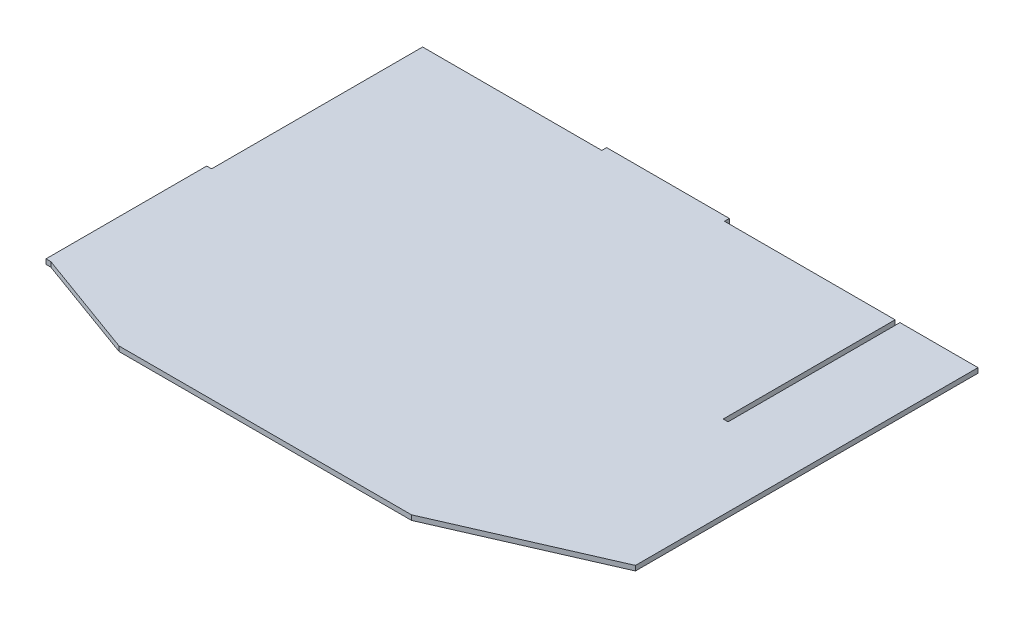
ISO-10303-21;
HEADER;
FILE_DESCRIPTION(('STEP AP214'),'2;1');
FILE_NAME('part.step','',(''),(''),'','','');
FILE_SCHEMA(('AUTOMOTIVE_DESIGN { 1 0 10303 214 1 1 1 1 }'));
ENDSEC;
DATA;
#1=APPLICATION_CONTEXT('core data for automotive mechanical design processes');
#2=APPLICATION_PROTOCOL_DEFINITION('international standard','automotive_design',2000,#1);
#3=PRODUCT_CONTEXT('',#1,'mechanical');
#4=PRODUCT('Part','Part','',(#3));
#5=PRODUCT_RELATED_PRODUCT_CATEGORY('part','',(#4));
#6=PRODUCT_DEFINITION_FORMATION('','',#4);
#7=PRODUCT_DEFINITION_CONTEXT('part definition',#1,'design');
#8=PRODUCT_DEFINITION('design','',#6,#7);
#9=PRODUCT_DEFINITION_SHAPE('','',#8);
#10=(LENGTH_UNIT() NAMED_UNIT(*) SI_UNIT(.MILLI.,.METRE.));
#11=(NAMED_UNIT(*) PLANE_ANGLE_UNIT() SI_UNIT($,.RADIAN.));
#12=(NAMED_UNIT(*) SI_UNIT($,.STERADIAN.) SOLID_ANGLE_UNIT());
#13=UNCERTAINTY_MEASURE_WITH_UNIT(LENGTH_MEASURE(1.E-05),#10,'distance_accuracy_value','');
#14=(GEOMETRIC_REPRESENTATION_CONTEXT(3) GLOBAL_UNCERTAINTY_ASSIGNED_CONTEXT((#13)) GLOBAL_UNIT_ASSIGNED_CONTEXT((#10,
#11,#12)) REPRESENTATION_CONTEXT('',''));
#15=CARTESIAN_POINT('',(0.,0.,0.));
#16=DIRECTION('',(0.,0.,1.));
#17=DIRECTION('',(1.,0.,0.));
#18=AXIS2_PLACEMENT_3D('',#15,#16,#17);
#19=CARTESIAN_POINT('',(-154.05608,-1.5875,267.83));
#20=DIRECTION('',(1.,0.,0.));
#21=DIRECTION('',(0.,0.,-1.));
#22=AXIS2_PLACEMENT_3D('',#19,#20,#21);
#23=PLANE('',#22);
#24=DIRECTION('',(0.,-1.,0.));
#25=VECTOR('',#24,1.);
#26=CARTESIAN_POINT('',(-154.05608,-1.59799669999838,137.650000036));
#27=LINE('',#26,#25);
#28=CARTESIAN_POINT('',(-154.05608,1.5875,137.650000036));
#29=VERTEX_POINT('',#28);
#30=CARTESIAN_POINT('',(-154.05608,-1.5875,137.650000036));
#31=VERTEX_POINT('',#30);
#32=EDGE_CURVE('E60',#29,#31,#27,.T.);
#33=ORIENTED_EDGE('',*,*,#32,.F.);
#34=DIRECTION('',(0.,0.,-1.));
#35=VECTOR('',#34,1.);
#36=CARTESIAN_POINT('',(-154.05608,1.5875,267.83));
#37=LINE('',#36,#35);
#38=CARTESIAN_POINT('',(-154.05608,1.5875,0.));
#39=VERTEX_POINT('',#38);
#40=EDGE_CURVE('E53',#29,#39,#37,.T.);
#41=ORIENTED_EDGE('',*,*,#40,.T.);
#42=DIRECTION('',(0.,-1.,0.));
#43=VECTOR('',#42,1.);
#44=CARTESIAN_POINT('',(-154.05608,-1.5875,0.));
#45=LINE('',#44,#43);
#46=CARTESIAN_POINT('',(-154.05608,-1.5875,0.));
#47=VERTEX_POINT('',#46);
#48=EDGE_CURVE('E291',#39,#47,#45,.T.);
#49=ORIENTED_EDGE('',*,*,#48,.T.);
#50=DIRECTION('',(0.,0.,-1.));
#51=VECTOR('',#50,1.);
#52=CARTESIAN_POINT('',(-154.05608,-1.5875,267.83));
#53=LINE('',#52,#51);
#54=EDGE_CURVE('E299',#31,#47,#53,.T.);
#55=ORIENTED_EDGE('',*,*,#54,.F.);
#56=EDGE_LOOP('',(#33,#41,#49,#55));
#57=FACE_BOUND('',#56,.T.);
#58=ADVANCED_FACE('F45',(#57),#23,.F.);
#59=CARTESIAN_POINT('',(0.,0.,0.));
#60=DIRECTION('',(0.,0.,-1.));
#61=DIRECTION('',(-1.,0.,0.));
#62=AXIS2_PLACEMENT_3D('',#59,#60,#61);
#63=PLANE('',#62);
#64=DIRECTION('',(-1.,0.,0.));
#65=VECTOR('',#64,1.);
#66=CARTESIAN_POINT('',(-154.05608,1.5875,0.));
#67=LINE('',#66,#65);
#68=CARTESIAN_POINT('',(-37.2160000199976,1.58750000000041,0.));
#69=VERTEX_POINT('',#68);
#70=EDGE_CURVE('E287',#69,#39,#67,.T.);
#71=ORIENTED_EDGE('',*,*,#70,.F.);
#72=DIRECTION('',(0.,1.,0.));
#73=VECTOR('',#72,1.);
#74=CARTESIAN_POINT('',(-37.2160000199976,1.58750000000041,0.));
#75=LINE('',#74,#73);
#76=CARTESIAN_POINT('',(-37.2160000199976,-1.5875000000004,0.));
#77=VERTEX_POINT('',#76);
#78=EDGE_CURVE('E207',#77,#69,#75,.T.);
#79=ORIENTED_EDGE('',*,*,#78,.F.);
#80=DIRECTION('',(1.,0.,0.));
#81=VECTOR('',#80,1.);
#82=CARTESIAN_POINT('',(-154.05608,-1.5875,0.));
#83=LINE('',#82,#81);
#84=EDGE_CURVE('E282',#47,#77,#83,.T.);
#85=ORIENTED_EDGE('',*,*,#84,.F.);
#86=ORIENTED_EDGE('',*,*,#48,.F.);
#87=EDGE_LOOP('',(#71,#79,#85,#86));
#88=FACE_BOUND('',#87,.T.);
#89=ADVANCED_FACE('F310',(#88),#63,.T.);
#90=CARTESIAN_POINT('',(42.7839999800023,-1.5875,0.));
#91=VERTEX_POINT('',#90);
#92=CARTESIAN_POINT('',(154.05608,-1.5875,0.));
#93=VERTEX_POINT('',#92);
#94=EDGE_CURVE('E294',#91,#93,#83,.T.);
#95=ORIENTED_EDGE('',*,*,#94,.F.);
#96=DIRECTION('',(0.,-1.,0.));
#97=VECTOR('',#96,1.);
#98=CARTESIAN_POINT('',(42.7839999800024,1.5875000000004,0.));
#99=LINE('',#98,#97);
#100=CARTESIAN_POINT('',(42.7839999800024,1.5875000000004,0.));
#101=VERTEX_POINT('',#100);
#102=EDGE_CURVE('E213',#101,#91,#99,.T.);
#103=ORIENTED_EDGE('',*,*,#102,.F.);
#104=CARTESIAN_POINT('',(154.05608,1.5875,0.));
#105=VERTEX_POINT('',#104);
#106=EDGE_CURVE('E288',#105,#101,#67,.T.);
#107=ORIENTED_EDGE('',*,*,#106,.F.);
#108=DIRECTION('',(0.,1.,0.));
#109=VECTOR('',#108,1.);
#110=CARTESIAN_POINT('',(154.05608,-1.5875,0.));
#111=LINE('',#110,#109);
#112=EDGE_CURVE('E277',#93,#105,#111,.T.);
#113=ORIENTED_EDGE('',*,*,#112,.F.);
#114=EDGE_LOOP('',(#95,#103,#107,#113));
#115=FACE_BOUND('',#114,.T.);
#116=ADVANCED_FACE('F364',(#115),#63,.T.);
#117=CARTESIAN_POINT('',(-154.05608,1.5875,267.83));
#118=DIRECTION('',(0.,-1.,0.));
#119=DIRECTION('',(0.,0.,-1.));
#120=AXIS2_PLACEMENT_3D('',#117,#118,#119);
#121=PLANE('',#120);
#122=ORIENTED_EDGE('',*,*,#40,.F.);
#123=DIRECTION('',(1.,0.,0.));
#124=VECTOR('',#123,1.);
#125=CARTESIAN_POINT('',(-157.23108,1.5875,137.650000036));
#126=LINE('',#125,#124);
#127=CARTESIAN_POINT('',(-157.23108,1.5875,137.650000036));
#128=VERTEX_POINT('',#127);
#129=EDGE_CURVE('E325',#128,#29,#126,.T.);
#130=ORIENTED_EDGE('',*,*,#129,.F.);
#131=DIRECTION('',(0.,0.,-1.));
#132=VECTOR('',#131,1.);
#133=CARTESIAN_POINT('',(-157.23108,1.5875,137.650000036));
#134=LINE('',#133,#132);
#135=CARTESIAN_POINT('',(-157.23108,1.5875,242.43));
#136=VERTEX_POINT('',#135);
#137=EDGE_CURVE('E185',#136,#128,#134,.T.);
#138=ORIENTED_EDGE('',*,*,#137,.F.);
#139=DIRECTION('',(1.,0.,0.));
#140=VECTOR('',#139,1.);
#141=CARTESIAN_POINT('',(-157.23108,1.5875,242.43));
#142=LINE('',#141,#140);
#143=CARTESIAN_POINT('',(-154.05608,1.5875,242.43));
#144=VERTEX_POINT('',#143);
#145=EDGE_CURVE('E198',#136,#144,#142,.T.);
#146=ORIENTED_EDGE('',*,*,#145,.T.);
#147=DIRECTION('',(0.939793423488437,0.,0.341743063086704));
#148=VECTOR('',#147,1.);
#149=CARTESIAN_POINT('',(-95.8526808759125,1.58750000000041,263.594872408759));
#150=LINE('',#149,#148);
#151=CARTESIAN_POINT('',(-84.20608,1.58750000000041,267.83));
#152=VERTEX_POINT('',#151);
#153=EDGE_CURVE('E68',#144,#152,#150,.T.);
#154=ORIENTED_EDGE('',*,*,#153,.T.);
#155=DIRECTION('',(-1.,0.,0.));
#156=VECTOR('',#155,1.);
#157=CARTESIAN_POINT('',(-154.05608,1.5875,267.83));
#158=LINE('',#157,#156);
#159=CARTESIAN_POINT('',(106.50474,1.5875,267.83));
#160=VERTEX_POINT('',#159);
#161=EDGE_CURVE('E278',#160,#152,#158,.T.);
#162=ORIENTED_EDGE('',*,*,#161,.F.);
#163=DIRECTION('',(0.916157334902189,0.,-0.400818834019708));
#164=VECTOR('',#163,1.);
#165=CARTESIAN_POINT('',(115.461286098361,1.5875,263.911511081967));
#166=LINE('',#165,#164);
#167=CARTESIAN_POINT('',(208.10474,1.5875,223.38));
#168=VERTEX_POINT('',#167);
#169=EDGE_CURVE('E231',#160,#168,#166,.T.);
#170=ORIENTED_EDGE('',*,*,#169,.T.);
#171=DIRECTION('',(0.,0.,1.));
#172=VECTOR('',#171,1.);
#173=CARTESIAN_POINT('',(208.10474,1.5875,0.));
#174=LINE('',#173,#172);
#175=CARTESIAN_POINT('',(208.10474,1.5875,0.));
#176=VERTEX_POINT('',#175);
#177=EDGE_CURVE('E258',#176,#168,#174,.T.);
#178=ORIENTED_EDGE('',*,*,#177,.F.);
#179=DIRECTION('',(-1.,0.,0.));
#180=VECTOR('',#179,1.);
#181=CARTESIAN_POINT('',(157.23108,1.5875,0.));
#182=LINE('',#181,#180);
#183=CARTESIAN_POINT('',(157.23108,1.5875,0.));
#184=VERTEX_POINT('',#183);
#185=EDGE_CURVE('E250',#176,#184,#182,.T.);
#186=ORIENTED_EDGE('',*,*,#185,.T.);
#187=DIRECTION('',(0.,0.,1.));
#188=VECTOR('',#187,1.);
#189=CARTESIAN_POINT('',(157.23108,1.5875,0.));
#190=LINE('',#189,#188);
#191=CARTESIAN_POINT('',(157.23108,1.5875,112.128));
#192=VERTEX_POINT('',#191);
#193=EDGE_CURVE('E254',#184,#192,#190,.T.);
#194=ORIENTED_EDGE('',*,*,#193,.T.);
#195=DIRECTION('',(-1.,0.,0.));
#196=VECTOR('',#195,1.);
#197=CARTESIAN_POINT('',(157.23108,1.5875,112.128));
#198=LINE('',#197,#196);
#199=CARTESIAN_POINT('',(154.05608,1.5875,112.128));
#200=VERTEX_POINT('',#199);
#201=EDGE_CURVE('E269',#192,#200,#198,.T.);
#202=ORIENTED_EDGE('',*,*,#201,.T.);
#203=DIRECTION('',(0.,0.,-1.));
#204=VECTOR('',#203,1.);
#205=CARTESIAN_POINT('',(154.05608,1.5875,267.83));
#206=LINE('',#205,#204);
#207=EDGE_CURVE('E11',#200,#105,#206,.T.);
#208=ORIENTED_EDGE('',*,*,#207,.T.);
#209=ORIENTED_EDGE('',*,*,#106,.T.);
#210=DIRECTION('',(0.,0.,1.));
#211=VECTOR('',#210,1.);
#212=CARTESIAN_POINT('',(42.7839999800024,1.5875000000004,-3.175));
#213=LINE('',#212,#211);
#214=CARTESIAN_POINT('',(42.7839999800024,1.5875000000004,-3.175));
#215=VERTEX_POINT('',#214);
#216=EDGE_CURVE('E227',#215,#101,#213,.T.);
#217=ORIENTED_EDGE('',*,*,#216,.F.);
#218=DIRECTION('',(1.,0.,0.));
#219=VECTOR('',#218,1.);
#220=CARTESIAN_POINT('',(-37.2160000199976,1.58750000000041,-3.175));
#221=LINE('',#220,#219);
#222=CARTESIAN_POINT('',(-37.2160000199976,1.58750000000041,-3.175));
#223=VERTEX_POINT('',#222);
#224=EDGE_CURVE('E212',#223,#215,#221,.T.);
#225=ORIENTED_EDGE('',*,*,#224,.F.);
#226=DIRECTION('',(0.,0.,1.));
#227=VECTOR('',#226,1.);
#228=CARTESIAN_POINT('',(-37.2160000199976,1.58750000000041,-3.175));
#229=LINE('',#228,#227);
#230=EDGE_CURVE('E229',#223,#69,#229,.T.);
#231=ORIENTED_EDGE('',*,*,#230,.T.);
#232=ORIENTED_EDGE('',*,*,#70,.T.);
#233=EDGE_LOOP('',(#122,#130,#138,#146,#154,#162,#170,#178,#186,#194,#202,#208,#209,#217,#225,
#231,#232));
#234=FACE_BOUND('',#233,.T.);
#235=ADVANCED_FACE('F306',(#234),#121,.F.);
#236=CARTESIAN_POINT('',(-154.05608,-1.5875,267.83));
#237=DIRECTION('',(0.,1.,0.));
#238=DIRECTION('',(0.,0.,1.));
#239=AXIS2_PLACEMENT_3D('',#236,#237,#238);
#240=PLANE('',#239);
#241=DIRECTION('',(1.,0.,0.));
#242=VECTOR('',#241,1.);
#243=CARTESIAN_POINT('',(-154.05608,-1.5875,267.83));
#244=LINE('',#243,#242);
#245=CARTESIAN_POINT('',(-84.20608,-1.5875,267.83));
#246=VERTEX_POINT('',#245);
#247=CARTESIAN_POINT('',(106.50474,-1.5875,267.83));
#248=VERTEX_POINT('',#247);
#249=EDGE_CURVE('E281',#246,#248,#244,.T.);
#250=ORIENTED_EDGE('',*,*,#249,.F.);
#251=DIRECTION('',(0.939793423488437,0.,0.341743063086704));
#252=VECTOR('',#251,1.);
#253=CARTESIAN_POINT('',(-95.8526808759125,-1.5875,263.594872408759));
#254=LINE('',#253,#252);
#255=CARTESIAN_POINT('',(-154.05608,-1.5875,242.43));
#256=VERTEX_POINT('',#255);
#257=EDGE_CURVE('E195',#256,#246,#254,.T.);
#258=ORIENTED_EDGE('',*,*,#257,.F.);
#259=EDGE_CURVE('E300',#256,#31,#53,.T.);
#260=ORIENTED_EDGE('',*,*,#259,.T.);
#261=ORIENTED_EDGE('',*,*,#54,.T.);
#262=ORIENTED_EDGE('',*,*,#84,.T.);
#263=DIRECTION('',(0.,0.,1.));
#264=VECTOR('',#263,1.);
#265=CARTESIAN_POINT('',(-37.2160000199976,-1.5875000000004,-3.175));
#266=LINE('',#265,#264);
#267=CARTESIAN_POINT('',(-37.2160000199976,-1.5875000000004,-3.175));
#268=VERTEX_POINT('',#267);
#269=EDGE_CURVE('E219',#268,#77,#266,.T.);
#270=ORIENTED_EDGE('',*,*,#269,.F.);
#271=DIRECTION('',(-1.,0.,0.));
#272=VECTOR('',#271,1.);
#273=CARTESIAN_POINT('',(-37.2160000199976,-1.5875000000004,-3.175));
#274=LINE('',#273,#272);
#275=CARTESIAN_POINT('',(42.7839999800024,-1.58750000000041,-3.175));
#276=VERTEX_POINT('',#275);
#277=EDGE_CURVE('E217',#276,#268,#274,.T.);
#278=ORIENTED_EDGE('',*,*,#277,.F.);
#279=DIRECTION('',(0.,0.,1.));
#280=VECTOR('',#279,1.);
#281=CARTESIAN_POINT('',(42.7839999800024,-1.58750000000041,-3.175));
#282=LINE('',#281,#280);
#283=EDGE_CURVE('E225',#276,#91,#282,.T.);
#284=ORIENTED_EDGE('',*,*,#283,.T.);
#285=ORIENTED_EDGE('',*,*,#94,.T.);
#286=DIRECTION('',(0.,0.,-1.));
#287=VECTOR('',#286,1.);
#288=CARTESIAN_POINT('',(154.05608,-1.5875,267.83));
#289=LINE('',#288,#287);
#290=CARTESIAN_POINT('',(154.05608,-1.5875,112.128));
#291=VERTEX_POINT('',#290);
#292=EDGE_CURVE('E284',#291,#93,#289,.T.);
#293=ORIENTED_EDGE('',*,*,#292,.F.);
#294=DIRECTION('',(-1.,0.,0.));
#295=VECTOR('',#294,1.);
#296=CARTESIAN_POINT('',(157.23108,-1.5875,112.128));
#297=LINE('',#296,#295);
#298=CARTESIAN_POINT('',(157.23108,-1.5875,112.128));
#299=VERTEX_POINT('',#298);
#300=EDGE_CURVE('E274',#299,#291,#297,.T.);
#301=ORIENTED_EDGE('',*,*,#300,.F.);
#302=DIRECTION('',(0.,0.,1.));
#303=VECTOR('',#302,1.);
#304=CARTESIAN_POINT('',(157.23108,-1.5875,0.));
#305=LINE('',#304,#303);
#306=CARTESIAN_POINT('',(157.23108,-1.5875,0.));
#307=VERTEX_POINT('',#306);
#308=EDGE_CURVE('E253',#307,#299,#305,.T.);
#309=ORIENTED_EDGE('',*,*,#308,.F.);
#310=DIRECTION('',(1.,0.,0.));
#311=VECTOR('',#310,1.);
#312=CARTESIAN_POINT('',(157.23108,-1.5875,0.));
#313=LINE('',#312,#311);
#314=CARTESIAN_POINT('',(208.10474,-1.5875,0.));
#315=VERTEX_POINT('',#314);
#316=EDGE_CURVE('E244',#307,#315,#313,.T.);
#317=ORIENTED_EDGE('',*,*,#316,.T.);
#318=DIRECTION('',(0.,0.,1.));
#319=VECTOR('',#318,1.);
#320=CARTESIAN_POINT('',(208.10474,-1.5875,0.));
#321=LINE('',#320,#319);
#322=CARTESIAN_POINT('',(208.10474,-1.5875,223.38));
#323=VERTEX_POINT('',#322);
#324=EDGE_CURVE('E261',#315,#323,#321,.T.);
#325=ORIENTED_EDGE('',*,*,#324,.T.);
#326=DIRECTION('',(0.916157334902189,0.,-0.400818834019708));
#327=VECTOR('',#326,1.);
#328=CARTESIAN_POINT('',(115.461286098361,-1.5875,263.911511081967));
#329=LINE('',#328,#327);
#330=EDGE_CURVE('E232',#248,#323,#329,.T.);
#331=ORIENTED_EDGE('',*,*,#330,.F.);
#332=EDGE_LOOP('',(#250,#258,#260,#261,#262,#270,#278,#284,#285,#293,#301,#309,#317,#325,#331));
#333=FACE_BOUND('',#332,.T.);
#334=ADVANCED_FACE('F314',(#333),#240,.F.);
#335=CARTESIAN_POINT('',(0.,0.,267.83));
#336=DIRECTION('',(0.,0.,-1.));
#337=DIRECTION('',(-1.,0.,0.));
#338=AXIS2_PLACEMENT_3D('',#335,#336,#337);
#339=PLANE('',#338);
#340=ORIENTED_EDGE('',*,*,#161,.T.);
#341=DIRECTION('',(0.,-1.,0.));
#342=VECTOR('',#341,1.);
#343=CARTESIAN_POINT('',(-84.20608,1.58750000000041,267.83));
#344=LINE('',#343,#342);
#345=EDGE_CURVE('E204',#152,#246,#344,.T.);
#346=ORIENTED_EDGE('',*,*,#345,.T.);
#347=ORIENTED_EDGE('',*,*,#249,.T.);
#348=DIRECTION('',(0.,1.,0.));
#349=VECTOR('',#348,1.);
#350=CARTESIAN_POINT('',(106.50474,-1.5875,267.83));
#351=LINE('',#350,#349);
#352=EDGE_CURVE('E234',#248,#160,#351,.T.);
#353=ORIENTED_EDGE('',*,*,#352,.T.);
#354=EDGE_LOOP('',(#340,#346,#347,#353));
#355=FACE_BOUND('',#354,.T.);
#356=ADVANCED_FACE('F340',(#355),#339,.F.);
#357=CARTESIAN_POINT('',(208.10474,-1.5875,0.));
#358=DIRECTION('',(1.,0.,0.));
#359=DIRECTION('',(0.,0.,-1.));
#360=AXIS2_PLACEMENT_3D('',#357,#358,#359);
#361=PLANE('',#360);
#362=ORIENTED_EDGE('',*,*,#177,.T.);
#363=DIRECTION('',(0.,1.,0.));
#364=VECTOR('',#363,1.);
#365=CARTESIAN_POINT('',(208.10474,-1.5875,223.38));
#366=LINE('',#365,#364);
#367=EDGE_CURVE('E237',#323,#168,#366,.T.);
#368=ORIENTED_EDGE('',*,*,#367,.F.);
#369=ORIENTED_EDGE('',*,*,#324,.F.);
#370=DIRECTION('',(0.,1.,0.));
#371=VECTOR('',#370,1.);
#372=CARTESIAN_POINT('',(208.10474,-1.5875,0.));
#373=LINE('',#372,#371);
#374=EDGE_CURVE('E247',#315,#176,#373,.T.);
#375=ORIENTED_EDGE('',*,*,#374,.T.);
#376=EDGE_LOOP('',(#362,#368,#369,#375));
#377=FACE_BOUND('',#376,.T.);
#378=ADVANCED_FACE('F345',(#377),#361,.T.);
#379=CARTESIAN_POINT('',(154.05608,-1.5875,267.83));
#380=DIRECTION('',(-1.,0.,0.));
#381=DIRECTION('',(0.,0.,1.));
#382=AXIS2_PLACEMENT_3D('',#379,#380,#381);
#383=PLANE('',#382);
#384=DIRECTION('',(0.,1.,0.));
#385=VECTOR('',#384,1.);
#386=CARTESIAN_POINT('',(154.05608,-1.5875,112.128));
#387=LINE('',#386,#385);
#388=EDGE_CURVE('E257',#291,#200,#387,.T.);
#389=ORIENTED_EDGE('',*,*,#388,.F.);
#390=ORIENTED_EDGE('',*,*,#292,.T.);
#391=ORIENTED_EDGE('',*,*,#112,.T.);
#392=ORIENTED_EDGE('',*,*,#207,.F.);
#393=EDGE_LOOP('',(#389,#390,#391,#392));
#394=FACE_BOUND('',#393,.T.);
#395=ADVANCED_FACE('F47',(#394),#383,.F.);
#396=CARTESIAN_POINT('',(157.23108,-1.5875,112.128));
#397=DIRECTION('',(0.,0.,1.));
#398=DIRECTION('',(1.,0.,0.));
#399=AXIS2_PLACEMENT_3D('',#396,#397,#398);
#400=PLANE('',#399);
#401=ORIENTED_EDGE('',*,*,#388,.T.);
#402=ORIENTED_EDGE('',*,*,#201,.F.);
#403=DIRECTION('',(0.,1.,0.));
#404=VECTOR('',#403,1.);
#405=CARTESIAN_POINT('',(157.23108,-1.5875,112.128));
#406=LINE('',#405,#404);
#407=EDGE_CURVE('E266',#299,#192,#406,.T.);
#408=ORIENTED_EDGE('',*,*,#407,.F.);
#409=ORIENTED_EDGE('',*,*,#300,.T.);
#410=EDGE_LOOP('',(#401,#402,#408,#409));
#411=FACE_BOUND('',#410,.T.);
#412=ADVANCED_FACE('F356',(#411),#400,.F.);
#413=CARTESIAN_POINT('',(157.23108,-1.5875,0.));
#414=DIRECTION('',(-1.,0.,0.));
#415=DIRECTION('',(0.,0.,1.));
#416=AXIS2_PLACEMENT_3D('',#413,#414,#415);
#417=PLANE('',#416);
#418=ORIENTED_EDGE('',*,*,#308,.T.);
#419=ORIENTED_EDGE('',*,*,#407,.T.);
#420=ORIENTED_EDGE('',*,*,#193,.F.);
#421=DIRECTION('',(0.,-1.,0.));
#422=VECTOR('',#421,1.);
#423=CARTESIAN_POINT('',(157.23108,-1.5875,0.));
#424=LINE('',#423,#422);
#425=EDGE_CURVE('E239',#184,#307,#424,.T.);
#426=ORIENTED_EDGE('',*,*,#425,.T.);
#427=EDGE_LOOP('',(#418,#419,#420,#426));
#428=FACE_BOUND('',#427,.T.);
#429=ADVANCED_FACE('F353',(#428),#417,.T.);
#430=CARTESIAN_POINT('',(0.,0.,0.));
#431=DIRECTION('',(0.,0.,-1.));
#432=DIRECTION('',(-1.,0.,0.));
#433=AXIS2_PLACEMENT_3D('',#430,#431,#432);
#434=PLANE('',#433);
#435=ORIENTED_EDGE('',*,*,#425,.F.);
#436=ORIENTED_EDGE('',*,*,#185,.F.);
#437=ORIENTED_EDGE('',*,*,#374,.F.);
#438=ORIENTED_EDGE('',*,*,#316,.F.);
#439=EDGE_LOOP('',(#435,#436,#437,#438));
#440=FACE_BOUND('',#439,.T.);
#441=ADVANCED_FACE('F351',(#440),#434,.T.);
#442=CARTESIAN_POINT('',(115.461286098361,-1.5875,263.911511081967));
#443=DIRECTION('',(0.400818834019708,0.,0.916157334902189));
#444=DIRECTION('',(0.916157334902189,0.,-0.400818834019708));
#445=AXIS2_PLACEMENT_3D('',#442,#443,#444);
#446=PLANE('',#445);
#447=ORIENTED_EDGE('',*,*,#169,.F.);
#448=ORIENTED_EDGE('',*,*,#352,.F.);
#449=ORIENTED_EDGE('',*,*,#330,.T.);
#450=ORIENTED_EDGE('',*,*,#367,.T.);
#451=EDGE_LOOP('',(#447,#448,#449,#450));
#452=FACE_BOUND('',#451,.T.);
#453=ADVANCED_FACE('F342',(#452),#446,.T.);
#454=CARTESIAN_POINT('',(-37.2160000199976,1.58750000000041,-3.175));
#455=DIRECTION('',(1.,0.,0.));
#456=DIRECTION('',(0.,0.,-1.));
#457=AXIS2_PLACEMENT_3D('',#454,#455,#456);
#458=PLANE('',#457);
#459=ORIENTED_EDGE('',*,*,#78,.T.);
#460=ORIENTED_EDGE('',*,*,#230,.F.);
#461=DIRECTION('',(0.,1.,0.));
#462=VECTOR('',#461,1.);
#463=CARTESIAN_POINT('',(-37.2160000199976,1.58750000000041,-3.175));
#464=LINE('',#463,#462);
#465=EDGE_CURVE('E209',#268,#223,#464,.T.);
#466=ORIENTED_EDGE('',*,*,#465,.F.);
#467=ORIENTED_EDGE('',*,*,#269,.T.);
#468=EDGE_LOOP('',(#459,#460,#466,#467));
#469=FACE_BOUND('',#468,.T.);
#470=ADVANCED_FACE('F373',(#469),#458,.F.);
#471=CARTESIAN_POINT('',(42.7839999800024,1.5875000000004,-3.175));
#472=DIRECTION('',(-1.,0.,0.));
#473=DIRECTION('',(0.,-1.,0.));
#474=AXIS2_PLACEMENT_3D('',#471,#472,#473);
#475=PLANE('',#474);
#476=ORIENTED_EDGE('',*,*,#102,.T.);
#477=ORIENTED_EDGE('',*,*,#283,.F.);
#478=DIRECTION('',(0.,-1.,0.));
#479=VECTOR('',#478,1.);
#480=CARTESIAN_POINT('',(42.7839999800024,1.5875000000004,-3.175));
#481=LINE('',#480,#479);
#482=EDGE_CURVE('E215',#215,#276,#481,.T.);
#483=ORIENTED_EDGE('',*,*,#482,.F.);
#484=ORIENTED_EDGE('',*,*,#216,.T.);
#485=EDGE_LOOP('',(#476,#477,#483,#484));
#486=FACE_BOUND('',#485,.T.);
#487=ADVANCED_FACE('F369',(#486),#475,.F.);
#488=CARTESIAN_POINT('',(0.,0.,-3.175));
#489=DIRECTION('',(0.,0.,1.));
#490=DIRECTION('',(1.,0.,0.));
#491=AXIS2_PLACEMENT_3D('',#488,#489,#490);
#492=PLANE('',#491);
#493=ORIENTED_EDGE('',*,*,#465,.T.);
#494=ORIENTED_EDGE('',*,*,#224,.T.);
#495=ORIENTED_EDGE('',*,*,#482,.T.);
#496=ORIENTED_EDGE('',*,*,#277,.T.);
#497=EDGE_LOOP('',(#493,#494,#495,#496));
#498=FACE_BOUND('',#497,.T.);
#499=ADVANCED_FACE('F371',(#498),#492,.F.);
#500=CARTESIAN_POINT('',(-95.8526808759125,1.58750000000041,263.594872408759));
#501=DIRECTION('',(0.341743063086704,0.,-0.939793423488437));
#502=DIRECTION('',(-0.939793423488437,0.,-0.341743063086704));
#503=AXIS2_PLACEMENT_3D('',#500,#501,#502);
#504=PLANE('',#503);
#505=ORIENTED_EDGE('',*,*,#257,.T.);
#506=ORIENTED_EDGE('',*,*,#345,.F.);
#507=ORIENTED_EDGE('',*,*,#153,.F.);
#508=DIRECTION('',(0.,-1.,0.));
#509=VECTOR('',#508,1.);
#510=CARTESIAN_POINT('',(-154.05608,1.58750000000041,242.43));
#511=LINE('',#510,#509);
#512=EDGE_CURVE('E202',#144,#256,#511,.T.);
#513=ORIENTED_EDGE('',*,*,#512,.T.);
#514=EDGE_LOOP('',(#505,#506,#507,#513));
#515=FACE_BOUND('',#514,.T.);
#516=ADVANCED_FACE('F336',(#515),#504,.F.);
#517=CARTESIAN_POINT('',(-154.05608,0.,0.));
#518=DIRECTION('',(1.,0.,0.));
#519=DIRECTION('',(0.,0.,-1.));
#520=AXIS2_PLACEMENT_3D('',#517,#518,#519);
#521=PLANE('',#520);
#522=ORIENTED_EDGE('',*,*,#259,.F.);
#523=DIRECTION('',(0.,1.,0.));
#524=VECTOR('',#523,1.);
#525=CARTESIAN_POINT('',(-154.05608,-1.59799669999838,242.43));
#526=LINE('',#525,#524);
#527=CARTESIAN_POINT('',(-154.05608,-1.59799669999838,242.43));
#528=VERTEX_POINT('',#527);
#529=EDGE_CURVE('E189',#528,#256,#526,.T.);
#530=ORIENTED_EDGE('',*,*,#529,.F.);
#531=DIRECTION('',(0.,0.,1.));
#532=VECTOR('',#531,1.);
#533=CARTESIAN_POINT('',(-154.05608,-1.59799669999838,137.650000036));
#534=LINE('',#533,#532);
#535=CARTESIAN_POINT('',(-154.05608,-1.59799669999838,137.650000036));
#536=VERTEX_POINT('',#535);
#537=EDGE_CURVE('E323',#536,#528,#534,.T.);
#538=ORIENTED_EDGE('',*,*,#537,.F.);
#539=EDGE_CURVE('E193',#31,#536,#27,.T.);
#540=ORIENTED_EDGE('',*,*,#539,.F.);
#541=EDGE_LOOP('',(#522,#530,#538,#540));
#542=FACE_BOUND('',#541,.T.);
#543=ADVANCED_FACE('F320',(#542),#521,.T.);
#544=CARTESIAN_POINT('',(-157.23108,-1.59799669999838,137.650000036));
#545=DIRECTION('',(0.,0.,1.));
#546=DIRECTION('',(1.,0.,0.));
#547=AXIS2_PLACEMENT_3D('',#544,#545,#546);
#548=PLANE('',#547);
#549=ORIENTED_EDGE('',*,*,#32,.T.);
#550=ORIENTED_EDGE('',*,*,#539,.T.);
#551=DIRECTION('',(1.,0.,0.));
#552=VECTOR('',#551,1.);
#553=CARTESIAN_POINT('',(-157.23108,-1.59799669999838,137.650000036));
#554=LINE('',#553,#552);
#555=CARTESIAN_POINT('',(-157.23108,-1.59799669999838,137.650000036));
#556=VERTEX_POINT('',#555);
#557=EDGE_CURVE('E174',#556,#536,#554,.T.);
#558=ORIENTED_EDGE('',*,*,#557,.F.);
#559=DIRECTION('',(0.,-1.,0.));
#560=VECTOR('',#559,1.);
#561=CARTESIAN_POINT('',(-157.23108,-1.59799669999838,137.650000036));
#562=LINE('',#561,#560);
#563=EDGE_CURVE('E180',#128,#556,#562,.T.);
#564=ORIENTED_EDGE('',*,*,#563,.F.);
#565=ORIENTED_EDGE('',*,*,#129,.T.);
#566=EDGE_LOOP('',(#549,#550,#558,#564,#565));
#567=FACE_BOUND('',#566,.T.);
#568=ADVANCED_FACE('F191',(#567),#548,.F.);
#569=CARTESIAN_POINT('',(-157.23108,-1.59799669999838,137.650000036));
#570=DIRECTION('',(0.,1.,0.));
#571=DIRECTION('',(0.,0.,1.));
#572=AXIS2_PLACEMENT_3D('',#569,#570,#571);
#573=PLANE('',#572);
#574=ORIENTED_EDGE('',*,*,#537,.T.);
#575=DIRECTION('',(1.,0.,0.));
#576=VECTOR('',#575,1.);
#577=CARTESIAN_POINT('',(-157.23108,-1.59799669999838,242.43));
#578=LINE('',#577,#576);
#579=CARTESIAN_POINT('',(-157.23108,-1.59799669999838,242.43));
#580=VERTEX_POINT('',#579);
#581=EDGE_CURVE('E176',#580,#528,#578,.T.);
#582=ORIENTED_EDGE('',*,*,#581,.F.);
#583=DIRECTION('',(0.,0.,1.));
#584=VECTOR('',#583,1.);
#585=CARTESIAN_POINT('',(-157.23108,-1.59799669999838,137.650000036));
#586=LINE('',#585,#584);
#587=EDGE_CURVE('E170',#556,#580,#586,.T.);
#588=ORIENTED_EDGE('',*,*,#587,.F.);
#589=ORIENTED_EDGE('',*,*,#557,.T.);
#590=EDGE_LOOP('',(#574,#582,#588,#589));
#591=FACE_BOUND('',#590,.T.);
#592=ADVANCED_FACE('F172',(#591),#573,.F.);
#593=CARTESIAN_POINT('',(-157.23108,-1.59799669999838,242.43));
#594=DIRECTION('',(0.,0.,-1.));
#595=DIRECTION('',(-1.,0.,0.));
#596=AXIS2_PLACEMENT_3D('',#593,#594,#595);
#597=PLANE('',#596);
#598=ORIENTED_EDGE('',*,*,#529,.T.);
#599=ORIENTED_EDGE('',*,*,#512,.F.);
#600=ORIENTED_EDGE('',*,*,#145,.F.);
#601=DIRECTION('',(0.,1.,0.));
#602=VECTOR('',#601,1.);
#603=CARTESIAN_POINT('',(-157.23108,-1.59799669999838,242.43));
#604=LINE('',#603,#602);
#605=EDGE_CURVE('E179',#580,#136,#604,.T.);
#606=ORIENTED_EDGE('',*,*,#605,.F.);
#607=ORIENTED_EDGE('',*,*,#581,.T.);
#608=EDGE_LOOP('',(#598,#599,#600,#606,#607));
#609=FACE_BOUND('',#608,.T.);
#610=ADVANCED_FACE('F335',(#609),#597,.F.);
#611=CARTESIAN_POINT('',(-157.23108,0.,0.));
#612=DIRECTION('',(1.,0.,0.));
#613=DIRECTION('',(0.,0.,-1.));
#614=AXIS2_PLACEMENT_3D('',#611,#612,#613);
#615=PLANE('',#614);
#616=ORIENTED_EDGE('',*,*,#563,.T.);
#617=ORIENTED_EDGE('',*,*,#587,.T.);
#618=ORIENTED_EDGE('',*,*,#605,.T.);
#619=ORIENTED_EDGE('',*,*,#137,.T.);
#620=EDGE_LOOP('',(#616,#617,#618,#619));
#621=FACE_BOUND('',#620,.T.);
#622=ADVANCED_FACE('F183',(#621),#615,.F.);
#623=CLOSED_SHELL('',(#58,#89,#116,#235,#334,#356,#378,#395,#412,#429,#441,#453,#470,#487,#499,
#516,#543,#568,#592,#610,#622));
#624=MANIFOLD_SOLID_BREP('B2',#623);
#625=ADVANCED_BREP_SHAPE_REPRESENTATION('',(#18,#624),#14);
#626=SHAPE_DEFINITION_REPRESENTATION(#9,#625);
ENDSEC;
END-ISO-10303-21;
